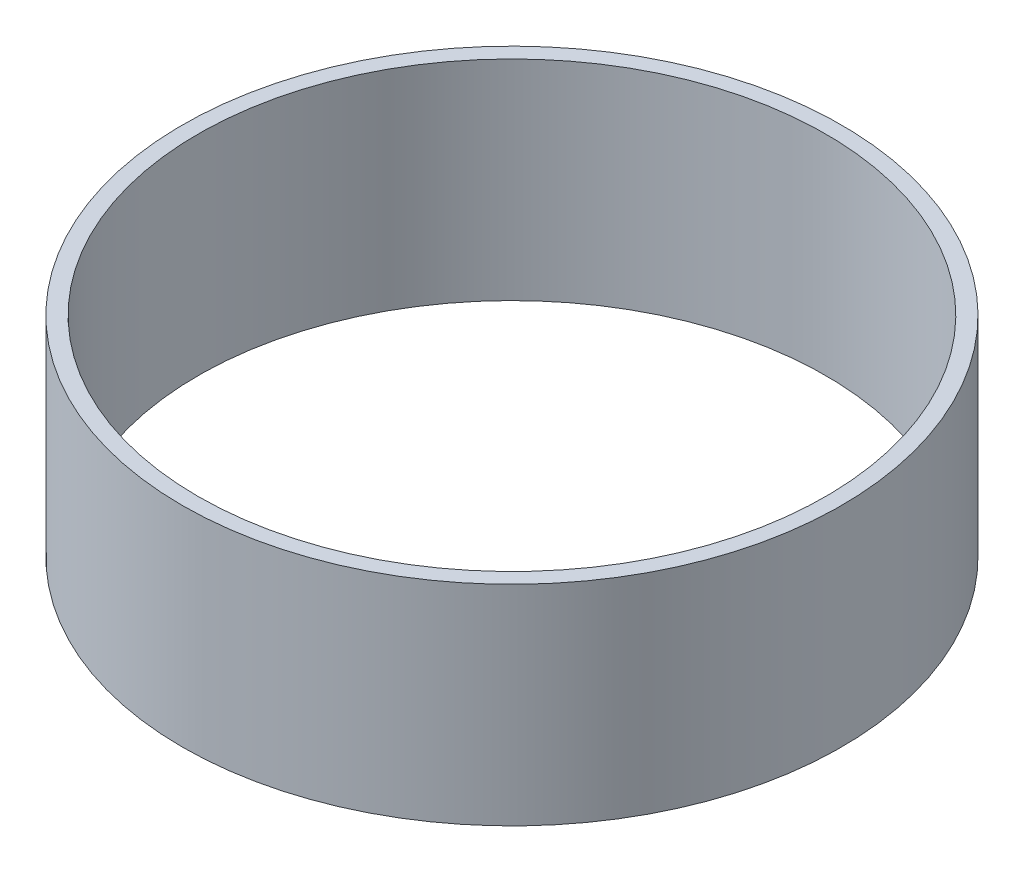
ISO-10303-21;
HEADER;
FILE_DESCRIPTION(('STEP AP214'),'2;1');
FILE_NAME('part.step','',(''),(''),'','','');
FILE_SCHEMA(('AUTOMOTIVE_DESIGN { 1 0 10303 214 1 1 1 1 }'));
ENDSEC;
DATA;
#1=APPLICATION_CONTEXT('core data for automotive mechanical design processes');
#2=APPLICATION_PROTOCOL_DEFINITION('international standard','automotive_design',2000,#1);
#3=PRODUCT_CONTEXT('',#1,'mechanical');
#4=PRODUCT('Part','Part','',(#3));
#5=PRODUCT_RELATED_PRODUCT_CATEGORY('part','',(#4));
#6=PRODUCT_DEFINITION_FORMATION('','',#4);
#7=PRODUCT_DEFINITION_CONTEXT('part definition',#1,'design');
#8=PRODUCT_DEFINITION('design','',#6,#7);
#9=PRODUCT_DEFINITION_SHAPE('','',#8);
#10=(LENGTH_UNIT() NAMED_UNIT(*) SI_UNIT(.MILLI.,.METRE.));
#11=(NAMED_UNIT(*) PLANE_ANGLE_UNIT() SI_UNIT($,.RADIAN.));
#12=(NAMED_UNIT(*) SI_UNIT($,.STERADIAN.) SOLID_ANGLE_UNIT());
#13=UNCERTAINTY_MEASURE_WITH_UNIT(LENGTH_MEASURE(1.E-05),#10,'distance_accuracy_value','');
#14=(GEOMETRIC_REPRESENTATION_CONTEXT(3) GLOBAL_UNCERTAINTY_ASSIGNED_CONTEXT((#13)) GLOBAL_UNIT_ASSIGNED_CONTEXT((#10,
#11,#12)) REPRESENTATION_CONTEXT('',''));
#15=CARTESIAN_POINT('',(0.,0.,0.));
#16=DIRECTION('',(0.,0.,1.));
#17=DIRECTION('',(1.,0.,0.));
#18=AXIS2_PLACEMENT_3D('',#15,#16,#17);
#19=CARTESIAN_POINT('',(0.,20.,0.));
#20=DIRECTION('',(0.,1.,0.));
#21=DIRECTION('',(0.,0.,1.));
#22=AXIS2_PLACEMENT_3D('',#19,#20,#21);
#23=PLANE('',#22);
#24=CARTESIAN_POINT('',(0.,20.,0.));
#25=DIRECTION('',(0.,1.,0.));
#26=DIRECTION('',(0.,0.,1.));
#27=AXIS2_PLACEMENT_3D('',#24,#25,#26);
#28=CIRCLE('',#27,63.);
#29=CARTESIAN_POINT('',(0.,20.,63.));
#30=VERTEX_POINT('',#29);
#31=EDGE_CURVE('E10',#30,#30,#28,.T.);
#32=ORIENTED_EDGE('',*,*,#31,.T.);
#33=EDGE_LOOP('',(#32));
#34=FACE_BOUND('',#33,.T.);
#35=CARTESIAN_POINT('',(0.,20.,0.));
#36=DIRECTION('',(0.,1.,0.));
#37=DIRECTION('',(0.,0.,1.));
#38=AXIS2_PLACEMENT_3D('',#35,#36,#37);
#39=CIRCLE('',#38,60.);
#40=CARTESIAN_POINT('',(0.,20.,60.));
#41=VERTEX_POINT('',#40);
#42=EDGE_CURVE('E46',#41,#41,#39,.T.);
#43=ORIENTED_EDGE('',*,*,#42,.F.);
#44=EDGE_LOOP('',(#43));
#45=FACE_BOUND('',#44,.T.);
#46=ADVANCED_FACE('F35',(#34,#45),#23,.T.);
#47=CARTESIAN_POINT('',(0.,-20.,0.));
#48=DIRECTION('',(0.,1.,0.));
#49=DIRECTION('',(0.,0.,1.));
#50=AXIS2_PLACEMENT_3D('',#47,#48,#49);
#51=PLANE('',#50);
#52=CARTESIAN_POINT('',(0.,-20.,0.));
#53=DIRECTION('',(0.,1.,0.));
#54=DIRECTION('',(0.,0.,1.));
#55=AXIS2_PLACEMENT_3D('',#52,#53,#54);
#56=CIRCLE('',#55,63.);
#57=CARTESIAN_POINT('',(0.,-20.,63.));
#58=VERTEX_POINT('',#57);
#59=EDGE_CURVE('E39',#58,#58,#56,.T.);
#60=ORIENTED_EDGE('',*,*,#59,.F.);
#61=EDGE_LOOP('',(#60));
#62=FACE_BOUND('',#61,.T.);
#63=CARTESIAN_POINT('',(0.,-20.,0.));
#64=DIRECTION('',(0.,1.,0.));
#65=DIRECTION('',(0.,0.,1.));
#66=AXIS2_PLACEMENT_3D('',#63,#64,#65);
#67=CIRCLE('',#66,60.);
#68=CARTESIAN_POINT('',(0.,-20.,60.));
#69=VERTEX_POINT('',#68);
#70=EDGE_CURVE('E48',#69,#69,#67,.T.);
#71=ORIENTED_EDGE('',*,*,#70,.T.);
#72=EDGE_LOOP('',(#71));
#73=FACE_BOUND('',#72,.T.);
#74=ADVANCED_FACE('F58',(#62,#73),#51,.F.);
#75=CARTESIAN_POINT('',(0.,20.,0.));
#76=DIRECTION('',(0.,-1.,0.));
#77=DIRECTION('',(0.,0.,-1.));
#78=AXIS2_PLACEMENT_3D('',#75,#76,#77);
#79=CYLINDRICAL_SURFACE('',#78,63.);
#80=ORIENTED_EDGE('',*,*,#31,.F.);
#81=EDGE_LOOP('',(#80));
#82=FACE_BOUND('',#81,.T.);
#83=ORIENTED_EDGE('',*,*,#59,.T.);
#84=EDGE_LOOP('',(#83));
#85=FACE_BOUND('',#84,.T.);
#86=ADVANCED_FACE('F37',(#82,#85),#79,.T.);
#87=CARTESIAN_POINT('',(0.,20.,0.));
#88=DIRECTION('',(0.,-1.,0.));
#89=DIRECTION('',(0.,0.,-1.));
#90=AXIS2_PLACEMENT_3D('',#87,#88,#89);
#91=CYLINDRICAL_SURFACE('',#90,60.);
#92=ORIENTED_EDGE('',*,*,#42,.T.);
#93=EDGE_LOOP('',(#92));
#94=FACE_BOUND('',#93,.T.);
#95=ORIENTED_EDGE('',*,*,#70,.F.);
#96=EDGE_LOOP('',(#95));
#97=FACE_BOUND('',#96,.T.);
#98=ADVANCED_FACE('F54',(#94,#97),#91,.F.);
#99=CLOSED_SHELL('',(#46,#74,#86,#98));
#100=MANIFOLD_SOLID_BREP('B2',#99);
#101=ADVANCED_BREP_SHAPE_REPRESENTATION('',(#18,#100),#14);
#102=SHAPE_DEFINITION_REPRESENTATION(#9,#101);
ENDSEC;
END-ISO-10303-21;
